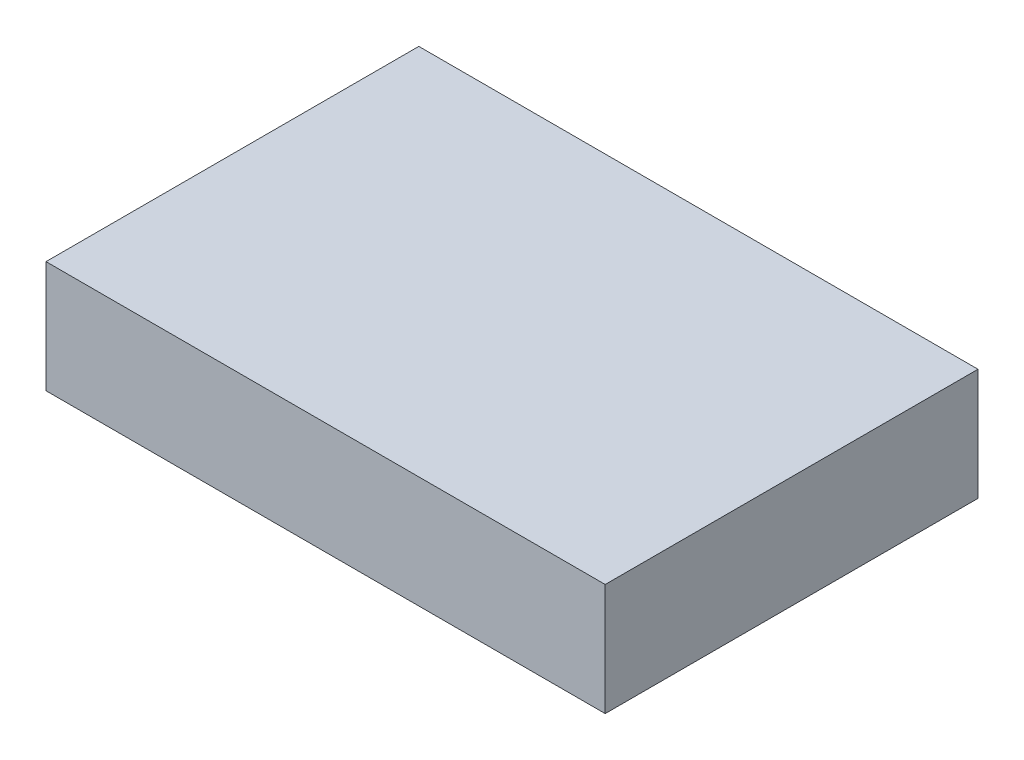
ISO-10303-21;
HEADER;
FILE_DESCRIPTION(('STEP AP214'),'2;1');
FILE_NAME('part.step','',(''),(''),'','','');
FILE_SCHEMA(('AUTOMOTIVE_DESIGN { 1 0 10303 214 1 1 1 1 }'));
ENDSEC;
DATA;
#1=APPLICATION_CONTEXT('core data for automotive mechanical design processes');
#2=APPLICATION_PROTOCOL_DEFINITION('international standard','automotive_design',2000,#1);
#3=PRODUCT_CONTEXT('',#1,'mechanical');
#4=PRODUCT('Part','Part','',(#3));
#5=PRODUCT_RELATED_PRODUCT_CATEGORY('part','',(#4));
#6=PRODUCT_DEFINITION_FORMATION('','',#4);
#7=PRODUCT_DEFINITION_CONTEXT('part definition',#1,'design');
#8=PRODUCT_DEFINITION('design','',#6,#7);
#9=PRODUCT_DEFINITION_SHAPE('','',#8);
#10=(LENGTH_UNIT() NAMED_UNIT(*) SI_UNIT(.MILLI.,.METRE.));
#11=(NAMED_UNIT(*) PLANE_ANGLE_UNIT() SI_UNIT($,.RADIAN.));
#12=(NAMED_UNIT(*) SI_UNIT($,.STERADIAN.) SOLID_ANGLE_UNIT());
#13=UNCERTAINTY_MEASURE_WITH_UNIT(LENGTH_MEASURE(1.E-05),#10,'distance_accuracy_value','');
#14=(GEOMETRIC_REPRESENTATION_CONTEXT(3) GLOBAL_UNCERTAINTY_ASSIGNED_CONTEXT((#13)) GLOBAL_UNIT_ASSIGNED_CONTEXT((#10,
#11,#12)) REPRESENTATION_CONTEXT('',''));
#15=CARTESIAN_POINT('',(0.,0.,0.));
#16=DIRECTION('',(0.,0.,1.));
#17=DIRECTION('',(1.,0.,0.));
#18=AXIS2_PLACEMENT_3D('',#15,#16,#17);
#19=CARTESIAN_POINT('',(0.,0.,100.));
#20=DIRECTION('',(1.,0.,0.));
#21=DIRECTION('',(0.,0.,-1.));
#22=AXIS2_PLACEMENT_3D('',#19,#20,#21);
#23=PLANE('',#22);
#24=DIRECTION('',(0.,-1.,0.));
#25=VECTOR('',#24,1.);
#26=CARTESIAN_POINT('',(0.,0.,0.));
#27=LINE('',#26,#25);
#28=CARTESIAN_POINT('',(0.,30.,0.));
#29=VERTEX_POINT('',#28);
#30=CARTESIAN_POINT('',(0.,0.,0.));
#31=VERTEX_POINT('',#30);
#32=EDGE_CURVE('E100',#29,#31,#27,.T.);
#33=ORIENTED_EDGE('',*,*,#32,.T.);
#34=DIRECTION('',(0.,0.,-1.));
#35=VECTOR('',#34,1.);
#36=CARTESIAN_POINT('',(0.,0.,100.));
#37=LINE('',#36,#35);
#38=CARTESIAN_POINT('',(0.,0.,100.));
#39=VERTEX_POINT('',#38);
#40=EDGE_CURVE('E11',#39,#31,#37,.T.);
#41=ORIENTED_EDGE('',*,*,#40,.F.);
#42=DIRECTION('',(0.,-1.,0.));
#43=VECTOR('',#42,1.);
#44=CARTESIAN_POINT('',(0.,0.,100.));
#45=LINE('',#44,#43);
#46=CARTESIAN_POINT('',(0.,30.,100.));
#47=VERTEX_POINT('',#46);
#48=EDGE_CURVE('E88',#47,#39,#45,.T.);
#49=ORIENTED_EDGE('',*,*,#48,.F.);
#50=DIRECTION('',(0.,0.,-1.));
#51=VECTOR('',#50,1.);
#52=CARTESIAN_POINT('',(0.,30.,100.));
#53=LINE('',#52,#51);
#54=EDGE_CURVE('E96',#47,#29,#53,.T.);
#55=ORIENTED_EDGE('',*,*,#54,.T.);
#56=EDGE_LOOP('',(#33,#41,#49,#55));
#57=FACE_BOUND('',#56,.T.);
#58=ADVANCED_FACE('F37',(#57),#23,.F.);
#59=CARTESIAN_POINT('',(0.,0.,100.));
#60=DIRECTION('',(0.,1.,0.));
#61=DIRECTION('',(0.,0.,1.));
#62=AXIS2_PLACEMENT_3D('',#59,#60,#61);
#63=PLANE('',#62);
#64=DIRECTION('',(1.,0.,0.));
#65=VECTOR('',#64,1.);
#66=CARTESIAN_POINT('',(0.,0.,0.));
#67=LINE('',#66,#65);
#68=CARTESIAN_POINT('',(150.,0.,0.));
#69=VERTEX_POINT('',#68);
#70=EDGE_CURVE('E92',#31,#69,#67,.T.);
#71=ORIENTED_EDGE('',*,*,#70,.T.);
#72=DIRECTION('',(0.,0.,-1.));
#73=VECTOR('',#72,1.);
#74=CARTESIAN_POINT('',(150.,0.,100.));
#75=LINE('',#74,#73);
#76=CARTESIAN_POINT('',(150.,0.,100.));
#77=VERTEX_POINT('',#76);
#78=EDGE_CURVE('E45',#77,#69,#75,.T.);
#79=ORIENTED_EDGE('',*,*,#78,.F.);
#80=DIRECTION('',(1.,0.,0.));
#81=VECTOR('',#80,1.);
#82=CARTESIAN_POINT('',(0.,0.,100.));
#83=LINE('',#82,#81);
#84=EDGE_CURVE('E83',#39,#77,#83,.T.);
#85=ORIENTED_EDGE('',*,*,#84,.F.);
#86=ORIENTED_EDGE('',*,*,#40,.T.);
#87=EDGE_LOOP('',(#71,#79,#85,#86));
#88=FACE_BOUND('',#87,.T.);
#89=ADVANCED_FACE('F91',(#88),#63,.F.);
#90=CARTESIAN_POINT('',(150.,0.,100.));
#91=DIRECTION('',(-1.,0.,0.));
#92=DIRECTION('',(0.,0.,1.));
#93=AXIS2_PLACEMENT_3D('',#90,#91,#92);
#94=PLANE('',#93);
#95=DIRECTION('',(0.,1.,0.));
#96=VECTOR('',#95,1.);
#97=CARTESIAN_POINT('',(150.,0.,0.));
#98=LINE('',#97,#96);
#99=CARTESIAN_POINT('',(150.,30.,0.));
#100=VERTEX_POINT('',#99);
#101=EDGE_CURVE('E70',#69,#100,#98,.T.);
#102=ORIENTED_EDGE('',*,*,#101,.T.);
#103=DIRECTION('',(0.,0.,-1.));
#104=VECTOR('',#103,1.);
#105=CARTESIAN_POINT('',(150.,30.,100.));
#106=LINE('',#105,#104);
#107=CARTESIAN_POINT('',(150.,30.,100.));
#108=VERTEX_POINT('',#107);
#109=EDGE_CURVE('E93',#108,#100,#106,.T.);
#110=ORIENTED_EDGE('',*,*,#109,.F.);
#111=DIRECTION('',(0.,1.,0.));
#112=VECTOR('',#111,1.);
#113=CARTESIAN_POINT('',(150.,0.,100.));
#114=LINE('',#113,#112);
#115=EDGE_CURVE('E86',#77,#108,#114,.T.);
#116=ORIENTED_EDGE('',*,*,#115,.F.);
#117=ORIENTED_EDGE('',*,*,#78,.T.);
#118=EDGE_LOOP('',(#102,#110,#116,#117));
#119=FACE_BOUND('',#118,.T.);
#120=ADVANCED_FACE('F94',(#119),#94,.F.);
#121=CARTESIAN_POINT('',(0.,30.,100.));
#122=DIRECTION('',(0.,-1.,0.));
#123=DIRECTION('',(0.,0.,-1.));
#124=AXIS2_PLACEMENT_3D('',#121,#122,#123);
#125=PLANE('',#124);
#126=DIRECTION('',(-1.,0.,0.));
#127=VECTOR('',#126,1.);
#128=CARTESIAN_POINT('',(0.,30.,0.));
#129=LINE('',#128,#127);
#130=EDGE_CURVE('E76',#100,#29,#129,.T.);
#131=ORIENTED_EDGE('',*,*,#130,.T.);
#132=ORIENTED_EDGE('',*,*,#54,.F.);
#133=DIRECTION('',(-1.,0.,0.));
#134=VECTOR('',#133,1.);
#135=CARTESIAN_POINT('',(0.,30.,100.));
#136=LINE('',#135,#134);
#137=EDGE_CURVE('E53',#108,#47,#136,.T.);
#138=ORIENTED_EDGE('',*,*,#137,.F.);
#139=ORIENTED_EDGE('',*,*,#109,.T.);
#140=EDGE_LOOP('',(#131,#132,#138,#139));
#141=FACE_BOUND('',#140,.T.);
#142=ADVANCED_FACE('F107',(#141),#125,.F.);
#143=CARTESIAN_POINT('',(0.,30.,100.));
#144=DIRECTION('',(0.,0.,-1.));
#145=DIRECTION('',(-1.,0.,0.));
#146=AXIS2_PLACEMENT_3D('',#143,#144,#145);
#147=PLANE('',#146);
#148=ORIENTED_EDGE('',*,*,#48,.T.);
#149=ORIENTED_EDGE('',*,*,#84,.T.);
#150=ORIENTED_EDGE('',*,*,#115,.T.);
#151=ORIENTED_EDGE('',*,*,#137,.T.);
#152=EDGE_LOOP('',(#148,#149,#150,#151));
#153=FACE_BOUND('',#152,.T.);
#154=ADVANCED_FACE('F84',(#153),#147,.F.);
#155=CARTESIAN_POINT('',(0.,30.,0.));
#156=DIRECTION('',(0.,0.,-1.));
#157=DIRECTION('',(-1.,0.,0.));
#158=AXIS2_PLACEMENT_3D('',#155,#156,#157);
#159=PLANE('',#158);
#160=ORIENTED_EDGE('',*,*,#32,.F.);
#161=ORIENTED_EDGE('',*,*,#130,.F.);
#162=ORIENTED_EDGE('',*,*,#101,.F.);
#163=ORIENTED_EDGE('',*,*,#70,.F.);
#164=EDGE_LOOP('',(#160,#161,#162,#163));
#165=FACE_BOUND('',#164,.T.);
#166=ADVANCED_FACE('F110',(#165),#159,.T.);
#167=CLOSED_SHELL('',(#58,#89,#120,#142,#154,#166));
#168=MANIFOLD_SOLID_BREP('B2',#167);
#169=ADVANCED_BREP_SHAPE_REPRESENTATION('',(#18,#168),#14);
#170=SHAPE_DEFINITION_REPRESENTATION(#9,#169);
ENDSEC;
END-ISO-10303-21;
